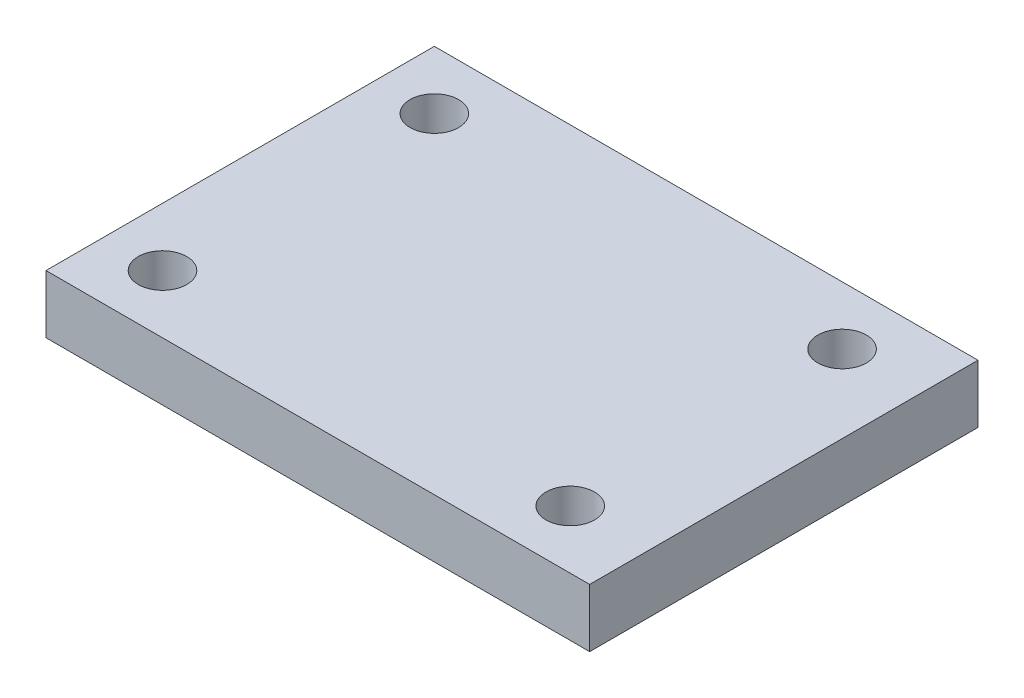
ISO-10303-21;
HEADER;
FILE_DESCRIPTION(('STEP AP214'),'2;1');
FILE_NAME('part.step','',(''),(''),'','','');
FILE_SCHEMA(('AUTOMOTIVE_DESIGN { 1 0 10303 214 1 1 1 1 }'));
ENDSEC;
DATA;
#1=APPLICATION_CONTEXT('core data for automotive mechanical design processes');
#2=APPLICATION_PROTOCOL_DEFINITION('international standard','automotive_design',2000,#1);
#3=PRODUCT_CONTEXT('',#1,'mechanical');
#4=PRODUCT('Part','Part','',(#3));
#5=PRODUCT_RELATED_PRODUCT_CATEGORY('part','',(#4));
#6=PRODUCT_DEFINITION_FORMATION('','',#4);
#7=PRODUCT_DEFINITION_CONTEXT('part definition',#1,'design');
#8=PRODUCT_DEFINITION('design','',#6,#7);
#9=PRODUCT_DEFINITION_SHAPE('','',#8);
#10=(LENGTH_UNIT() NAMED_UNIT(*) SI_UNIT(.MILLI.,.METRE.));
#11=(NAMED_UNIT(*) PLANE_ANGLE_UNIT() SI_UNIT($,.RADIAN.));
#12=(NAMED_UNIT(*) SI_UNIT($,.STERADIAN.) SOLID_ANGLE_UNIT());
#13=UNCERTAINTY_MEASURE_WITH_UNIT(LENGTH_MEASURE(1.E-05),#10,'distance_accuracy_value','');
#14=(GEOMETRIC_REPRESENTATION_CONTEXT(3) GLOBAL_UNCERTAINTY_ASSIGNED_CONTEXT((#13)) GLOBAL_UNIT_ASSIGNED_CONTEXT((#10,
#11,#12)) REPRESENTATION_CONTEXT('',''));
#15=CARTESIAN_POINT('',(0.,0.,0.));
#16=DIRECTION('',(0.,0.,1.));
#17=DIRECTION('',(1.,0.,0.));
#18=AXIS2_PLACEMENT_3D('',#15,#16,#17);
#19=CARTESIAN_POINT('',(-21.0090841155592,3.75,15.));
#20=DIRECTION('',(1.,0.,0.));
#21=DIRECTION('',(0.,0.,-1.));
#22=AXIS2_PLACEMENT_3D('',#19,#20,#21);
#23=PLANE('',#22);
#24=DIRECTION('',(0.,0.,1.));
#25=VECTOR('',#24,1.);
#26=CARTESIAN_POINT('',(-21.0090841155592,-0.75,15.));
#27=LINE('',#26,#25);
#28=CARTESIAN_POINT('',(-21.0090841155592,-0.75,-15.));
#29=VERTEX_POINT('',#28);
#30=CARTESIAN_POINT('',(-21.0090841155592,-0.75,15.));
#31=VERTEX_POINT('',#30);
#32=EDGE_CURVE('E102',#29,#31,#27,.T.);
#33=ORIENTED_EDGE('',*,*,#32,.T.);
#34=DIRECTION('',(0.,-1.,0.));
#35=VECTOR('',#34,1.);
#36=CARTESIAN_POINT('',(-21.0090841155592,3.75,15.));
#37=LINE('',#36,#35);
#38=CARTESIAN_POINT('',(-21.0090841155592,3.75,15.));
#39=VERTEX_POINT('',#38);
#40=EDGE_CURVE('E11',#39,#31,#37,.T.);
#41=ORIENTED_EDGE('',*,*,#40,.F.);
#42=DIRECTION('',(0.,0.,1.));
#43=VECTOR('',#42,1.);
#44=CARTESIAN_POINT('',(-21.0090841155592,3.75,15.));
#45=LINE('',#44,#43);
#46=CARTESIAN_POINT('',(-21.0090841155592,3.75,-15.));
#47=VERTEX_POINT('',#46);
#48=EDGE_CURVE('E90',#47,#39,#45,.T.);
#49=ORIENTED_EDGE('',*,*,#48,.F.);
#50=DIRECTION('',(0.,-1.,0.));
#51=VECTOR('',#50,1.);
#52=CARTESIAN_POINT('',(-21.0090841155592,3.75,-15.));
#53=LINE('',#52,#51);
#54=EDGE_CURVE('E98',#47,#29,#53,.T.);
#55=ORIENTED_EDGE('',*,*,#54,.T.);
#56=EDGE_LOOP('',(#33,#41,#49,#55));
#57=FACE_BOUND('',#56,.T.);
#58=ADVANCED_FACE('F39',(#57),#23,.F.);
#59=CARTESIAN_POINT('',(20.9909158844408,3.75,15.));
#60=DIRECTION('',(0.,0.,-1.));
#61=DIRECTION('',(-1.,0.,0.));
#62=AXIS2_PLACEMENT_3D('',#59,#60,#61);
#63=PLANE('',#62);
#64=DIRECTION('',(1.,0.,0.));
#65=VECTOR('',#64,1.);
#66=CARTESIAN_POINT('',(20.9909158844408,-0.75,15.));
#67=LINE('',#66,#65);
#68=CARTESIAN_POINT('',(20.9909158844408,-0.75,15.));
#69=VERTEX_POINT('',#68);
#70=EDGE_CURVE('E94',#31,#69,#67,.T.);
#71=ORIENTED_EDGE('',*,*,#70,.T.);
#72=DIRECTION('',(0.,-1.,0.));
#73=VECTOR('',#72,1.);
#74=CARTESIAN_POINT('',(20.9909158844408,3.75,15.));
#75=LINE('',#74,#73);
#76=CARTESIAN_POINT('',(20.9909158844408,3.75,15.));
#77=VERTEX_POINT('',#76);
#78=EDGE_CURVE('E47',#77,#69,#75,.T.);
#79=ORIENTED_EDGE('',*,*,#78,.F.);
#80=DIRECTION('',(1.,0.,0.));
#81=VECTOR('',#80,1.);
#82=CARTESIAN_POINT('',(20.9909158844408,3.75,15.));
#83=LINE('',#82,#81);
#84=EDGE_CURVE('E85',#39,#77,#83,.T.);
#85=ORIENTED_EDGE('',*,*,#84,.F.);
#86=ORIENTED_EDGE('',*,*,#40,.T.);
#87=EDGE_LOOP('',(#71,#79,#85,#86));
#88=FACE_BOUND('',#87,.T.);
#89=ADVANCED_FACE('F93',(#88),#63,.F.);
#90=CARTESIAN_POINT('',(20.9909158844408,3.75,15.));
#91=DIRECTION('',(-1.,0.,0.));
#92=DIRECTION('',(0.,0.,1.));
#93=AXIS2_PLACEMENT_3D('',#90,#91,#92);
#94=PLANE('',#93);
#95=DIRECTION('',(0.,0.,-1.));
#96=VECTOR('',#95,1.);
#97=CARTESIAN_POINT('',(20.9909158844408,-0.75,15.));
#98=LINE('',#97,#96);
#99=CARTESIAN_POINT('',(20.9909158844408,-0.75,-15.));
#100=VERTEX_POINT('',#99);
#101=EDGE_CURVE('E72',#69,#100,#98,.T.);
#102=ORIENTED_EDGE('',*,*,#101,.T.);
#103=DIRECTION('',(0.,-1.,0.));
#104=VECTOR('',#103,1.);
#105=CARTESIAN_POINT('',(20.9909158844408,3.75,-15.));
#106=LINE('',#105,#104);
#107=CARTESIAN_POINT('',(20.9909158844408,3.75,-15.));
#108=VERTEX_POINT('',#107);
#109=EDGE_CURVE('E95',#108,#100,#106,.T.);
#110=ORIENTED_EDGE('',*,*,#109,.F.);
#111=DIRECTION('',(0.,0.,-1.));
#112=VECTOR('',#111,1.);
#113=CARTESIAN_POINT('',(20.9909158844408,3.75,15.));
#114=LINE('',#113,#112);
#115=EDGE_CURVE('E88',#77,#108,#114,.T.);
#116=ORIENTED_EDGE('',*,*,#115,.F.);
#117=ORIENTED_EDGE('',*,*,#78,.T.);
#118=EDGE_LOOP('',(#102,#110,#116,#117));
#119=FACE_BOUND('',#118,.T.);
#120=ADVANCED_FACE('F96',(#119),#94,.F.);
#121=CARTESIAN_POINT('',(20.9909158844408,3.75,-15.));
#122=DIRECTION('',(0.,0.,1.));
#123=DIRECTION('',(1.,0.,0.));
#124=AXIS2_PLACEMENT_3D('',#121,#122,#123);
#125=PLANE('',#124);
#126=DIRECTION('',(-1.,0.,0.));
#127=VECTOR('',#126,1.);
#128=CARTESIAN_POINT('',(20.9909158844408,-0.75,-15.));
#129=LINE('',#128,#127);
#130=EDGE_CURVE('E78',#100,#29,#129,.T.);
#131=ORIENTED_EDGE('',*,*,#130,.T.);
#132=ORIENTED_EDGE('',*,*,#54,.F.);
#133=DIRECTION('',(-1.,0.,0.));
#134=VECTOR('',#133,1.);
#135=CARTESIAN_POINT('',(20.9909158844408,3.75,-15.));
#136=LINE('',#135,#134);
#137=EDGE_CURVE('E55',#108,#47,#136,.T.);
#138=ORIENTED_EDGE('',*,*,#137,.F.);
#139=ORIENTED_EDGE('',*,*,#109,.T.);
#140=EDGE_LOOP('',(#131,#132,#138,#139));
#141=FACE_BOUND('',#140,.T.);
#142=ADVANCED_FACE('F110',(#141),#125,.F.);
#143=CARTESIAN_POINT('',(-0.00908411555917915,3.75,0.));
#144=DIRECTION('',(0.,1.,0.));
#145=DIRECTION('',(0.,0.,1.));
#146=AXIS2_PLACEMENT_3D('',#143,#144,#145);
#147=PLANE('',#146);
#148=CARTESIAN_POINT('',(-16.5090841155592,3.75,-10.5));
#149=DIRECTION('',(0.,1.,0.));
#150=DIRECTION('',(0.,0.,1.));
#151=AXIS2_PLACEMENT_3D('',#148,#149,#150);
#152=CIRCLE('',#151,1.875);
#153=CARTESIAN_POINT('',(-16.5090841155592,3.75,-8.62500000000001));
#154=VERTEX_POINT('',#153);
#155=EDGE_CURVE('E136',#154,#154,#152,.T.);
#156=ORIENTED_EDGE('',*,*,#155,.F.);
#157=EDGE_LOOP('',(#156));
#158=FACE_BOUND('',#157,.T.);
#159=CARTESIAN_POINT('',(-16.5090841155592,3.75,10.5));
#160=DIRECTION('',(0.,1.,0.));
#161=DIRECTION('',(0.,0.,1.));
#162=AXIS2_PLACEMENT_3D('',#159,#160,#161);
#163=CIRCLE('',#162,1.875);
#164=CARTESIAN_POINT('',(-16.5090841155592,3.75,12.375));
#165=VERTEX_POINT('',#164);
#166=EDGE_CURVE('E130',#165,#165,#163,.T.);
#167=ORIENTED_EDGE('',*,*,#166,.F.);
#168=EDGE_LOOP('',(#167));
#169=FACE_BOUND('',#168,.T.);
#170=CARTESIAN_POINT('',(14.9909158844408,3.75,10.5));
#171=DIRECTION('',(0.,1.,0.));
#172=DIRECTION('',(0.,0.,1.));
#173=AXIS2_PLACEMENT_3D('',#170,#171,#172);
#174=CIRCLE('',#173,1.875);
#175=CARTESIAN_POINT('',(14.9909158844408,3.75,12.375));
#176=VERTEX_POINT('',#175);
#177=EDGE_CURVE('E124',#176,#176,#174,.T.);
#178=ORIENTED_EDGE('',*,*,#177,.F.);
#179=EDGE_LOOP('',(#178));
#180=FACE_BOUND('',#179,.T.);
#181=CARTESIAN_POINT('',(14.9909158844408,3.75,-10.5));
#182=DIRECTION('',(0.,1.,0.));
#183=DIRECTION('',(0.,0.,1.));
#184=AXIS2_PLACEMENT_3D('',#181,#182,#183);
#185=CIRCLE('',#184,1.875);
#186=CARTESIAN_POINT('',(14.9909158844408,3.75,-8.62500000000001));
#187=VERTEX_POINT('',#186);
#188=EDGE_CURVE('E118',#187,#187,#185,.T.);
#189=ORIENTED_EDGE('',*,*,#188,.F.);
#190=EDGE_LOOP('',(#189));
#191=FACE_BOUND('',#190,.T.);
#192=ORIENTED_EDGE('',*,*,#48,.T.);
#193=ORIENTED_EDGE('',*,*,#84,.T.);
#194=ORIENTED_EDGE('',*,*,#115,.T.);
#195=ORIENTED_EDGE('',*,*,#137,.T.);
#196=EDGE_LOOP('',(#192,#193,#194,#195));
#197=FACE_BOUND('',#196,.T.);
#198=ADVANCED_FACE('F86',(#158,#169,#180,#191,#197),#147,.T.);
#199=CARTESIAN_POINT('',(-0.00908411555917915,-0.75,0.));
#200=DIRECTION('',(0.,1.,0.));
#201=DIRECTION('',(0.,0.,1.));
#202=AXIS2_PLACEMENT_3D('',#199,#200,#201);
#203=PLANE('',#202);
#204=CARTESIAN_POINT('',(-16.5090841155592,-0.75,-10.5));
#205=DIRECTION('',(0.,1.,0.));
#206=DIRECTION('',(0.,0.,1.));
#207=AXIS2_PLACEMENT_3D('',#204,#205,#206);
#208=CIRCLE('',#207,1.875);
#209=CARTESIAN_POINT('',(-16.5090841155592,-0.75,-8.62500000000001));
#210=VERTEX_POINT('',#209);
#211=EDGE_CURVE('E133',#210,#210,#208,.T.);
#212=ORIENTED_EDGE('',*,*,#211,.T.);
#213=EDGE_LOOP('',(#212));
#214=FACE_BOUND('',#213,.T.);
#215=CARTESIAN_POINT('',(-16.5090841155592,-0.75,10.5));
#216=DIRECTION('',(0.,1.,0.));
#217=DIRECTION('',(0.,0.,1.));
#218=AXIS2_PLACEMENT_3D('',#215,#216,#217);
#219=CIRCLE('',#218,1.875);
#220=CARTESIAN_POINT('',(-16.5090841155592,-0.75,12.375));
#221=VERTEX_POINT('',#220);
#222=EDGE_CURVE('E127',#221,#221,#219,.T.);
#223=ORIENTED_EDGE('',*,*,#222,.T.);
#224=EDGE_LOOP('',(#223));
#225=FACE_BOUND('',#224,.T.);
#226=CARTESIAN_POINT('',(14.9909158844408,-0.75,10.5));
#227=DIRECTION('',(0.,1.,0.));
#228=DIRECTION('',(0.,0.,1.));
#229=AXIS2_PLACEMENT_3D('',#226,#227,#228);
#230=CIRCLE('',#229,1.875);
#231=CARTESIAN_POINT('',(14.9909158844408,-0.75,12.375));
#232=VERTEX_POINT('',#231);
#233=EDGE_CURVE('E121',#232,#232,#230,.T.);
#234=ORIENTED_EDGE('',*,*,#233,.T.);
#235=EDGE_LOOP('',(#234));
#236=FACE_BOUND('',#235,.T.);
#237=CARTESIAN_POINT('',(14.9909158844408,-0.75,-10.5));
#238=DIRECTION('',(0.,1.,0.));
#239=DIRECTION('',(0.,0.,1.));
#240=AXIS2_PLACEMENT_3D('',#237,#238,#239);
#241=CIRCLE('',#240,1.875);
#242=CARTESIAN_POINT('',(14.9909158844408,-0.75,-8.62500000000001));
#243=VERTEX_POINT('',#242);
#244=EDGE_CURVE('E105',#243,#243,#241,.T.);
#245=ORIENTED_EDGE('',*,*,#244,.T.);
#246=EDGE_LOOP('',(#245));
#247=FACE_BOUND('',#246,.T.);
#248=ORIENTED_EDGE('',*,*,#32,.F.);
#249=ORIENTED_EDGE('',*,*,#130,.F.);
#250=ORIENTED_EDGE('',*,*,#101,.F.);
#251=ORIENTED_EDGE('',*,*,#70,.F.);
#252=EDGE_LOOP('',(#248,#249,#250,#251));
#253=FACE_BOUND('',#252,.T.);
#254=ADVANCED_FACE('F113',(#214,#225,#236,#247,#253),#203,.F.);
#255=CARTESIAN_POINT('',(14.9909158844408,3.75,-10.5));
#256=DIRECTION('',(0.,1.,0.));
#257=DIRECTION('',(0.,0.,1.));
#258=AXIS2_PLACEMENT_3D('',#255,#256,#257);
#259=CYLINDRICAL_SURFACE('',#258,1.875);
#260=ORIENTED_EDGE('',*,*,#244,.F.);
#261=EDGE_LOOP('',(#260));
#262=FACE_BOUND('',#261,.T.);
#263=ORIENTED_EDGE('',*,*,#188,.T.);
#264=EDGE_LOOP('',(#263));
#265=FACE_BOUND('',#264,.T.);
#266=ADVANCED_FACE('F151',(#262,#265),#259,.F.);
#267=CARTESIAN_POINT('',(14.9909158844408,3.75,10.5));
#268=DIRECTION('',(0.,1.,0.));
#269=DIRECTION('',(0.,0.,1.));
#270=AXIS2_PLACEMENT_3D('',#267,#268,#269);
#271=CYLINDRICAL_SURFACE('',#270,1.875);
#272=ORIENTED_EDGE('',*,*,#233,.F.);
#273=EDGE_LOOP('',(#272));
#274=FACE_BOUND('',#273,.T.);
#275=ORIENTED_EDGE('',*,*,#177,.T.);
#276=EDGE_LOOP('',(#275));
#277=FACE_BOUND('',#276,.T.);
#278=ADVANCED_FACE('F153',(#274,#277),#271,.F.);
#279=CARTESIAN_POINT('',(-16.5090841155592,3.75,10.5));
#280=DIRECTION('',(0.,1.,0.));
#281=DIRECTION('',(0.,0.,1.));
#282=AXIS2_PLACEMENT_3D('',#279,#280,#281);
#283=CYLINDRICAL_SURFACE('',#282,1.875);
#284=ORIENTED_EDGE('',*,*,#222,.F.);
#285=EDGE_LOOP('',(#284));
#286=FACE_BOUND('',#285,.T.);
#287=ORIENTED_EDGE('',*,*,#166,.T.);
#288=EDGE_LOOP('',(#287));
#289=FACE_BOUND('',#288,.T.);
#290=ADVANCED_FACE('F160',(#286,#289),#283,.F.);
#291=CARTESIAN_POINT('',(-16.5090841155592,3.75,-10.5));
#292=DIRECTION('',(0.,1.,0.));
#293=DIRECTION('',(0.,0.,1.));
#294=AXIS2_PLACEMENT_3D('',#291,#292,#293);
#295=CYLINDRICAL_SURFACE('',#294,1.875);
#296=ORIENTED_EDGE('',*,*,#211,.F.);
#297=EDGE_LOOP('',(#296));
#298=FACE_BOUND('',#297,.T.);
#299=ORIENTED_EDGE('',*,*,#155,.T.);
#300=EDGE_LOOP('',(#299));
#301=FACE_BOUND('',#300,.T.);
#302=ADVANCED_FACE('F140',(#298,#301),#295,.F.);
#303=CLOSED_SHELL('',(#58,#89,#120,#142,#198,#254,#266,#278,#290,#302));
#304=MANIFOLD_SOLID_BREP('B2',#303);
#305=ADVANCED_BREP_SHAPE_REPRESENTATION('',(#18,#304),#14);
#306=SHAPE_DEFINITION_REPRESENTATION(#9,#305);
ENDSEC;
END-ISO-10303-21;
